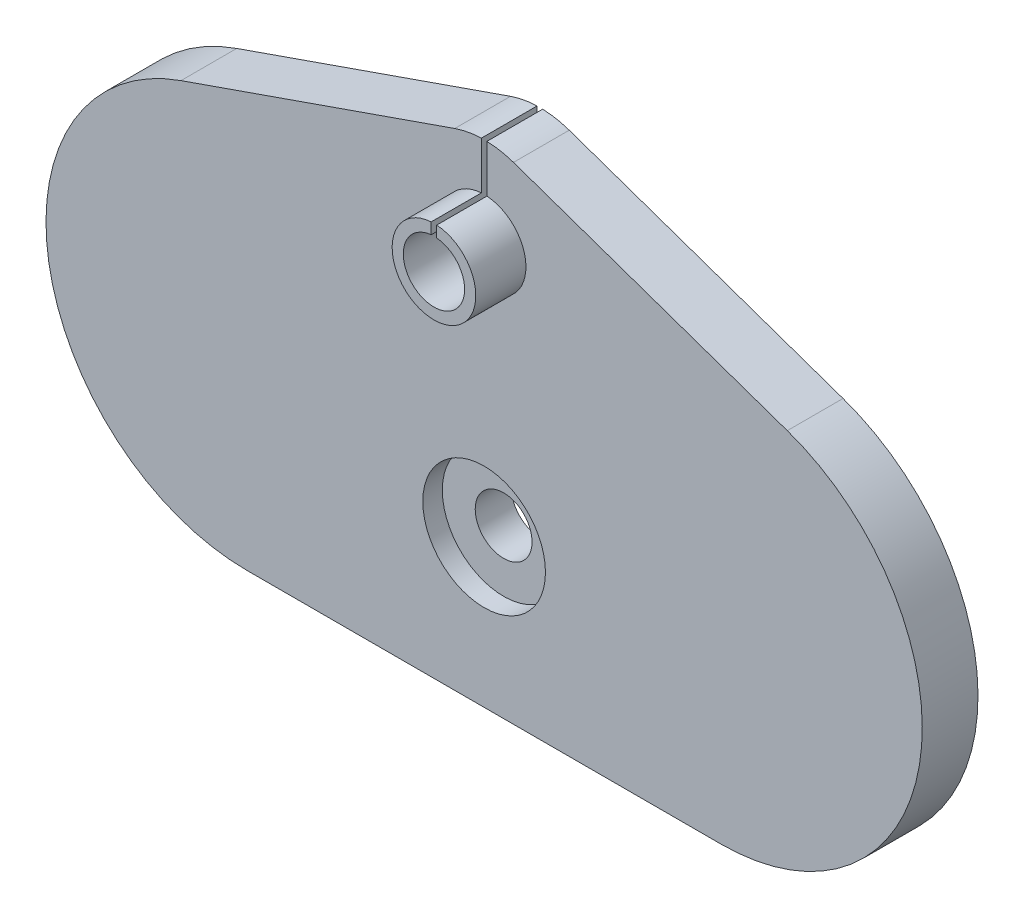
ISO-10303-21;
HEADER;
FILE_DESCRIPTION(('STEP AP214'),'2;1');
FILE_NAME('part.step','',(''),(''),'','','');
FILE_SCHEMA(('AUTOMOTIVE_DESIGN { 1 0 10303 214 1 1 1 1 }'));
ENDSEC;
DATA;
#1=APPLICATION_CONTEXT('core data for automotive mechanical design processes');
#2=APPLICATION_PROTOCOL_DEFINITION('international standard','automotive_design',2000,#1);
#3=PRODUCT_CONTEXT('',#1,'mechanical');
#4=PRODUCT('Part','Part','',(#3));
#5=PRODUCT_RELATED_PRODUCT_CATEGORY('part','',(#4));
#6=PRODUCT_DEFINITION_FORMATION('','',#4);
#7=PRODUCT_DEFINITION_CONTEXT('part definition',#1,'design');
#8=PRODUCT_DEFINITION('design','',#6,#7);
#9=PRODUCT_DEFINITION_SHAPE('','',#8);
#10=(LENGTH_UNIT() NAMED_UNIT(*) SI_UNIT(.MILLI.,.METRE.));
#11=(NAMED_UNIT(*) PLANE_ANGLE_UNIT() SI_UNIT($,.RADIAN.));
#12=(NAMED_UNIT(*) SI_UNIT($,.STERADIAN.) SOLID_ANGLE_UNIT());
#13=UNCERTAINTY_MEASURE_WITH_UNIT(LENGTH_MEASURE(1.E-05),#10,'distance_accuracy_value','');
#14=(GEOMETRIC_REPRESENTATION_CONTEXT(3) GLOBAL_UNCERTAINTY_ASSIGNED_CONTEXT((#13)) GLOBAL_UNIT_ASSIGNED_CONTEXT((#10,
#11,#12)) REPRESENTATION_CONTEXT('',''));
#15=CARTESIAN_POINT('',(0.,0.,0.));
#16=DIRECTION('',(0.,0.,1.));
#17=DIRECTION('',(1.,0.,0.));
#18=AXIS2_PLACEMENT_3D('',#15,#16,#17);
#19=CARTESIAN_POINT('',(0.,-16.,10.));
#20=DIRECTION('',(0.,0.,-1.));
#21=DIRECTION('',(-1.,0.,0.));
#22=AXIS2_PLACEMENT_3D('',#19,#20,#21);
#23=CYLINDRICAL_SURFACE('',#22,16.);
#24=DIRECTION('',(0.,0.,-1.));
#25=VECTOR('',#24,1.);
#26=CARTESIAN_POINT('',(0.5,-0.00781440828052579,10.));
#27=LINE('',#26,#25);
#28=CARTESIAN_POINT('',(0.5,-0.00781440828052579,10.));
#29=VERTEX_POINT('',#28);
#30=CARTESIAN_POINT('',(0.5,-0.00781440828052579,0.));
#31=VERTEX_POINT('',#30);
#32=EDGE_CURVE('E296',#29,#31,#27,.T.);
#33=ORIENTED_EDGE('',*,*,#32,.F.);
#34=CARTESIAN_POINT('',(0.,-16.,10.));
#35=DIRECTION('',(0.,0.,1.));
#36=DIRECTION('',(1.,0.,0.));
#37=AXIS2_PLACEMENT_3D('',#34,#35,#36);
#38=CIRCLE('',#37,16.);
#39=CARTESIAN_POINT('',(5.2663496670273,-0.891540078995424,10.));
#40=VERTEX_POINT('',#39);
#41=EDGE_CURVE('E259',#40,#29,#38,.T.);
#42=ORIENTED_EDGE('',*,*,#41,.F.);
#43=DIRECTION('',(0.,0.,-1.));
#44=VECTOR('',#43,1.);
#45=CARTESIAN_POINT('',(5.2663496670273,-0.891540078995424,10.));
#46=LINE('',#45,#44);
#47=CARTESIAN_POINT('',(5.2663496670273,-0.891540078995424,0.));
#48=VERTEX_POINT('',#47);
#49=EDGE_CURVE('E224',#40,#48,#46,.T.);
#50=ORIENTED_EDGE('',*,*,#49,.T.);
#51=CARTESIAN_POINT('',(0.,-16.,0.));
#52=DIRECTION('',(0.,0.,1.));
#53=DIRECTION('',(1.,0.,0.));
#54=AXIS2_PLACEMENT_3D('',#51,#52,#53);
#55=CIRCLE('',#54,16.);
#56=EDGE_CURVE('E184',#48,#31,#55,.T.);
#57=ORIENTED_EDGE('',*,*,#56,.T.);
#58=EDGE_LOOP('',(#33,#42,#50,#57));
#59=FACE_BOUND('',#58,.T.);
#60=ADVANCED_FACE('F45',(#59),#23,.T.);
#61=DIRECTION('',(0.,0.,-1.));
#62=VECTOR('',#61,1.);
#63=CARTESIAN_POINT('',(-0.5,-0.00781440828052579,10.));
#64=LINE('',#63,#62);
#65=CARTESIAN_POINT('',(-0.5,-0.00781440828052579,0.));
#66=VERTEX_POINT('',#65);
#67=CARTESIAN_POINT('',(-0.5,-0.00781440828052579,10.));
#68=VERTEX_POINT('',#67);
#69=EDGE_CURVE('E367',#66,#68,#64,.F.);
#70=ORIENTED_EDGE('',*,*,#69,.F.);
#71=CARTESIAN_POINT('',(-5.2663496670273,-0.891540078995424,0.));
#72=VERTEX_POINT('',#71);
#73=EDGE_CURVE('E165',#66,#72,#55,.T.);
#74=ORIENTED_EDGE('',*,*,#73,.T.);
#75=DIRECTION('',(0.,0.,-1.));
#76=VECTOR('',#75,1.);
#77=CARTESIAN_POINT('',(-5.2663496670273,-0.891540078995424,10.));
#78=LINE('',#77,#76);
#79=CARTESIAN_POINT('',(-5.2663496670273,-0.891540078995424,10.));
#80=VERTEX_POINT('',#79);
#81=EDGE_CURVE('E220',#80,#72,#78,.T.);
#82=ORIENTED_EDGE('',*,*,#81,.F.);
#83=EDGE_CURVE('E258',#68,#80,#38,.T.);
#84=ORIENTED_EDGE('',*,*,#83,.F.);
#85=EDGE_LOOP('',(#70,#74,#82,#84));
#86=FACE_BOUND('',#85,.T.);
#87=ADVANCED_FACE('F332',(#86),#23,.T.);
#88=CARTESIAN_POINT('',(0.,-16.,10.));
#89=DIRECTION('',(0.,0.,-1.));
#90=DIRECTION('',(-1.,0.,0.));
#91=AXIS2_PLACEMENT_3D('',#88,#89,#90);
#92=CYLINDRICAL_SURFACE('',#91,6.);
#93=CARTESIAN_POINT('',(0.,-16.,10.));
#94=DIRECTION('',(0.,0.,1.));
#95=DIRECTION('',(1.,0.,0.));
#96=AXIS2_PLACEMENT_3D('',#93,#94,#95);
#97=CIRCLE('',#96,6.);
#98=CARTESIAN_POINT('',(-0.5,-10.0208696284493,10.));
#99=VERTEX_POINT('',#98);
#100=CARTESIAN_POINT('',(0.5,-10.0208696284493,10.));
#101=VERTEX_POINT('',#100);
#102=EDGE_CURVE('E172',#99,#101,#97,.T.);
#103=ORIENTED_EDGE('',*,*,#102,.T.);
#104=DIRECTION('',(0.,0.,-1.));
#105=VECTOR('',#104,1.);
#106=CARTESIAN_POINT('',(0.5,-10.0208696284493,10.));
#107=LINE('',#106,#105);
#108=CARTESIAN_POINT('',(0.5,-10.0208696284493,0.));
#109=VERTEX_POINT('',#108);
#110=EDGE_CURVE('E169',#101,#109,#107,.T.);
#111=ORIENTED_EDGE('',*,*,#110,.T.);
#112=CARTESIAN_POINT('',(0.,-16.,0.));
#113=DIRECTION('',(0.,0.,1.));
#114=DIRECTION('',(1.,0.,0.));
#115=AXIS2_PLACEMENT_3D('',#112,#113,#114);
#116=CIRCLE('',#115,6.);
#117=CARTESIAN_POINT('',(-0.5,-10.0208696284493,0.));
#118=VERTEX_POINT('',#117);
#119=EDGE_CURVE('E163',#118,#109,#116,.T.);
#120=ORIENTED_EDGE('',*,*,#119,.F.);
#121=DIRECTION('',(0.,0.,-1.));
#122=VECTOR('',#121,1.);
#123=CARTESIAN_POINT('',(-0.5,-10.0208696284493,10.));
#124=LINE('',#123,#122);
#125=EDGE_CURVE('E144',#118,#99,#124,.F.);
#126=ORIENTED_EDGE('',*,*,#125,.T.);
#127=EDGE_LOOP('',(#103,#111,#120,#126));
#128=FACE_BOUND('',#127,.T.);
#129=ADVANCED_FACE('F47',(#128),#92,.F.);
#130=CARTESIAN_POINT('',(0.,0.,10.));
#131=DIRECTION('',(0.,0.,1.));
#132=DIRECTION('',(1.,0.,0.));
#133=AXIS2_PLACEMENT_3D('',#130,#131,#132);
#134=PLANE('',#133);
#135=CARTESIAN_POINT('',(0.,-61.6975077461451,10.));
#136=DIRECTION('',(0.,0.,1.));
#137=DIRECTION('',(1.,0.,0.));
#138=AXIS2_PLACEMENT_3D('',#135,#136,#137);
#139=CIRCLE('',#138,11.);
#140=CARTESIAN_POINT('',(11.,-61.6975077461451,10.));
#141=VERTEX_POINT('',#140);
#142=EDGE_CURVE('E181',#141,#141,#139,.T.);
#143=ORIENTED_EDGE('',*,*,#142,.F.);
#144=EDGE_LOOP('',(#143));
#145=FACE_BOUND('',#144,.T.);
#146=ORIENTED_EDGE('',*,*,#41,.T.);
#147=DIRECTION('',(0.,-1.,0.));
#148=VECTOR('',#147,1.);
#149=CARTESIAN_POINT('',(0.5,0.,10.));
#150=LINE('',#149,#148);
#151=CARTESIAN_POINT('',(0.5,-8.51668522645212,10.));
#152=VERTEX_POINT('',#151);
#153=EDGE_CURVE('E292',#29,#152,#150,.T.);
#154=ORIENTED_EDGE('',*,*,#153,.T.);
#155=CARTESIAN_POINT('',(0.,-16.,10.));
#156=DIRECTION('',(0.,0.,1.));
#157=DIRECTION('',(1.,0.,0.));
#158=AXIS2_PLACEMENT_3D('',#155,#156,#157);
#159=CIRCLE('',#158,7.5);
#160=CARTESIAN_POINT('',(-0.5,-8.51668522645212,10.));
#161=VERTEX_POINT('',#160);
#162=EDGE_CURVE('E242',#161,#152,#159,.T.);
#163=ORIENTED_EDGE('',*,*,#162,.F.);
#164=DIRECTION('',(0.,1.,0.));
#165=VECTOR('',#164,1.);
#166=CARTESIAN_POINT('',(-0.5,0.,10.));
#167=LINE('',#166,#165);
#168=EDGE_CURVE('E363',#161,#68,#167,.T.);
#169=ORIENTED_EDGE('',*,*,#168,.T.);
#170=ORIENTED_EDGE('',*,*,#83,.T.);
#171=DIRECTION('',(-0.944278745062786,-0.329146854189206,0.));
#172=VECTOR('',#171,1.);
#173=CARTESIAN_POINT('',(-0.293447612384942,0.841862346966983,10.));
#174=LINE('',#173,#172);
#175=CARTESIAN_POINT('',(-54.3805557019594,-18.0112586969587,10.));
#176=VERTEX_POINT('',#175);
#177=EDGE_CURVE('E263',#80,#176,#174,.T.);
#178=ORIENTED_EDGE('',*,*,#177,.T.);
#179=CARTESIAN_POINT('',(-42.5,-52.095,10.));
#180=DIRECTION('',(0.,0.,1.));
#181=DIRECTION('',(1.,0.,0.));
#182=AXIS2_PLACEMENT_3D('',#179,#180,#181);
#183=CIRCLE('',#182,36.095);
#184=CARTESIAN_POINT('',(-42.5,-88.19,10.));
#185=VERTEX_POINT('',#184);
#186=EDGE_CURVE('E267',#176,#185,#183,.T.);
#187=ORIENTED_EDGE('',*,*,#186,.T.);
#188=DIRECTION('',(1.,0.,0.));
#189=VECTOR('',#188,1.);
#190=CARTESIAN_POINT('',(0.,-88.19,10.));
#191=LINE('',#190,#189);
#192=CARTESIAN_POINT('',(42.5,-88.19,10.));
#193=VERTEX_POINT('',#192);
#194=EDGE_CURVE('E271',#185,#193,#191,.T.);
#195=ORIENTED_EDGE('',*,*,#194,.T.);
#196=CARTESIAN_POINT('',(42.5,-52.095,10.));
#197=DIRECTION('',(0.,0.,1.));
#198=DIRECTION('',(1.,0.,0.));
#199=AXIS2_PLACEMENT_3D('',#196,#197,#198);
#200=CIRCLE('',#199,36.095);
#201=CARTESIAN_POINT('',(54.3805557019594,-18.0112586969587,10.));
#202=VERTEX_POINT('',#201);
#203=EDGE_CURVE('E274',#193,#202,#200,.T.);
#204=ORIENTED_EDGE('',*,*,#203,.T.);
#205=DIRECTION('',(0.944278745062786,-0.329146854189206,0.));
#206=VECTOR('',#205,1.);
#207=CARTESIAN_POINT('',(0.293447612384942,0.841862346966983,10.));
#208=LINE('',#207,#206);
#209=EDGE_CURVE('E204',#40,#202,#208,.T.);
#210=ORIENTED_EDGE('',*,*,#209,.F.);
#211=EDGE_LOOP('',(#146,#154,#163,#169,#170,#178,#187,#195,#204,#210));
#212=FACE_BOUND('',#211,.T.);
#213=ADVANCED_FACE('F286',(#145,#212),#134,.T.);
#214=CARTESIAN_POINT('',(0.,0.,0.));
#215=DIRECTION('',(0.,0.,1.));
#216=DIRECTION('',(1.,0.,0.));
#217=AXIS2_PLACEMENT_3D('',#214,#215,#216);
#218=PLANE('',#217);
#219=CARTESIAN_POINT('',(-5.01437036244279E-13,-61.697507746145,0.));
#220=DIRECTION('',(0.,0.,-1.));
#221=DIRECTION('',(-1.,0.,0.));
#222=AXIS2_PLACEMENT_3D('',#219,#220,#221);
#223=CIRCLE('',#222,5.1);
#224=CARTESIAN_POINT('',(-5.1000000000005,-61.697507746145,0.));
#225=VERTEX_POINT('',#224);
#226=EDGE_CURVE('E298',#225,#225,#223,.T.);
#227=ORIENTED_EDGE('',*,*,#226,.F.);
#228=EDGE_LOOP('',(#227));
#229=FACE_BOUND('',#228,.T.);
#230=DIRECTION('',(0.,1.,0.));
#231=VECTOR('',#230,1.);
#232=CARTESIAN_POINT('',(0.5,-12.19,0.));
#233=LINE('',#232,#231);
#234=EDGE_CURVE('E352',#109,#31,#233,.T.);
#235=ORIENTED_EDGE('',*,*,#234,.T.);
#236=ORIENTED_EDGE('',*,*,#56,.F.);
#237=DIRECTION('',(0.944278745062786,-0.329146854189206,0.));
#238=VECTOR('',#237,1.);
#239=CARTESIAN_POINT('',(0.293447612384942,0.841862346966983,0.));
#240=LINE('',#239,#238);
#241=CARTESIAN_POINT('',(54.3805557019594,-18.0112586969587,0.));
#242=VERTEX_POINT('',#241);
#243=EDGE_CURVE('E171',#48,#242,#240,.T.);
#244=ORIENTED_EDGE('',*,*,#243,.T.);
#245=CARTESIAN_POINT('',(42.5,-52.095,0.));
#246=DIRECTION('',(0.,0.,1.));
#247=DIRECTION('',(1.,0.,0.));
#248=AXIS2_PLACEMENT_3D('',#245,#246,#247);
#249=CIRCLE('',#248,36.095);
#250=CARTESIAN_POINT('',(42.5,-88.19,0.));
#251=VERTEX_POINT('',#250);
#252=EDGE_CURVE('E200',#251,#242,#249,.T.);
#253=ORIENTED_EDGE('',*,*,#252,.F.);
#254=DIRECTION('',(1.,0.,0.));
#255=VECTOR('',#254,1.);
#256=CARTESIAN_POINT('',(0.,-88.19,0.));
#257=LINE('',#256,#255);
#258=CARTESIAN_POINT('',(-42.5,-88.19,0.));
#259=VERTEX_POINT('',#258);
#260=EDGE_CURVE('E196',#259,#251,#257,.T.);
#261=ORIENTED_EDGE('',*,*,#260,.F.);
#262=CARTESIAN_POINT('',(-42.5,-52.095,0.));
#263=DIRECTION('',(0.,0.,1.));
#264=DIRECTION('',(1.,0.,0.));
#265=AXIS2_PLACEMENT_3D('',#262,#263,#264);
#266=CIRCLE('',#265,36.095);
#267=CARTESIAN_POINT('',(-54.3805557019594,-18.0112586969587,0.));
#268=VERTEX_POINT('',#267);
#269=EDGE_CURVE('E192',#268,#259,#266,.T.);
#270=ORIENTED_EDGE('',*,*,#269,.F.);
#271=DIRECTION('',(-0.944278745062786,-0.329146854189206,0.));
#272=VECTOR('',#271,1.);
#273=CARTESIAN_POINT('',(-0.293447612384942,0.841862346966983,0.));
#274=LINE('',#273,#272);
#275=EDGE_CURVE('E188',#72,#268,#274,.T.);
#276=ORIENTED_EDGE('',*,*,#275,.F.);
#277=ORIENTED_EDGE('',*,*,#73,.F.);
#278=DIRECTION('',(0.,1.,0.));
#279=VECTOR('',#278,1.);
#280=CARTESIAN_POINT('',(-0.5,-12.19,0.));
#281=LINE('',#280,#279);
#282=EDGE_CURVE('E147',#118,#66,#281,.T.);
#283=ORIENTED_EDGE('',*,*,#282,.F.);
#284=ORIENTED_EDGE('',*,*,#119,.T.);
#285=EDGE_LOOP('',(#235,#236,#244,#253,#261,#270,#276,#277,#283,#284));
#286=FACE_BOUND('',#285,.T.);
#287=ADVANCED_FACE('F162',(#229,#286),#218,.F.);
#288=CARTESIAN_POINT('',(0.,-16.,10.));
#289=DIRECTION('',(0.,0.,1.));
#290=DIRECTION('',(1.,0.,0.));
#291=AXIS2_PLACEMENT_3D('',#288,#289,#290);
#292=PLANE('',#291);
#293=DIRECTION('',(0.,-1.,0.));
#294=VECTOR('',#293,1.);
#295=CARTESIAN_POINT('',(0.5,-16.,10.));
#296=LINE('',#295,#294);
#297=CARTESIAN_POINT('',(0.5,-10.5227744249483,10.));
#298=VERTEX_POINT('',#297);
#299=EDGE_CURVE('E61',#101,#298,#296,.T.);
#300=ORIENTED_EDGE('',*,*,#299,.F.);
#301=ORIENTED_EDGE('',*,*,#102,.F.);
#302=DIRECTION('',(0.,1.,0.));
#303=VECTOR('',#302,1.);
#304=CARTESIAN_POINT('',(-0.5,-16.,10.));
#305=LINE('',#304,#303);
#306=CARTESIAN_POINT('',(-0.5,-10.5227744249483,10.));
#307=VERTEX_POINT('',#306);
#308=EDGE_CURVE('E150',#307,#99,#305,.T.);
#309=ORIENTED_EDGE('',*,*,#308,.F.);
#310=CARTESIAN_POINT('',(0.,-16.,10.));
#311=DIRECTION('',(0.,0.,1.));
#312=DIRECTION('',(1.,0.,0.));
#313=AXIS2_PLACEMENT_3D('',#310,#311,#312);
#314=CIRCLE('',#313,5.5);
#315=EDGE_CURVE('E234',#307,#298,#314,.T.);
#316=ORIENTED_EDGE('',*,*,#315,.T.);
#317=EDGE_LOOP('',(#300,#301,#309,#316));
#318=FACE_BOUND('',#317,.T.);
#319=ADVANCED_FACE('F396',(#318),#292,.F.);
#320=CARTESIAN_POINT('',(0.,-16.,19.));
#321=DIRECTION('',(0.,0.,1.));
#322=DIRECTION('',(1.,0.,0.));
#323=AXIS2_PLACEMENT_3D('',#320,#321,#322);
#324=PLANE('',#323);
#325=CARTESIAN_POINT('',(0.,-16.,19.));
#326=DIRECTION('',(0.,0.,1.));
#327=DIRECTION('',(1.,0.,0.));
#328=AXIS2_PLACEMENT_3D('',#325,#326,#327);
#329=CIRCLE('',#328,7.5);
#330=CARTESIAN_POINT('',(-0.5,-8.51668522645212,19.));
#331=VERTEX_POINT('',#330);
#332=CARTESIAN_POINT('',(0.5,-8.51668522645212,19.));
#333=VERTEX_POINT('',#332);
#334=EDGE_CURVE('E178',#331,#333,#329,.T.);
#335=ORIENTED_EDGE('',*,*,#334,.T.);
#336=DIRECTION('',(0.,1.,0.));
#337=VECTOR('',#336,1.);
#338=CARTESIAN_POINT('',(0.5,-12.19,19.));
#339=LINE('',#338,#337);
#340=CARTESIAN_POINT('',(0.5,-10.5227744249483,19.));
#341=VERTEX_POINT('',#340);
#342=EDGE_CURVE('E240',#341,#333,#339,.T.);
#343=ORIENTED_EDGE('',*,*,#342,.F.);
#344=CARTESIAN_POINT('',(0.,-16.,19.));
#345=DIRECTION('',(0.,0.,1.));
#346=DIRECTION('',(1.,0.,0.));
#347=AXIS2_PLACEMENT_3D('',#344,#345,#346);
#348=CIRCLE('',#347,5.5);
#349=CARTESIAN_POINT('',(-0.5,-10.5227744249483,19.));
#350=VERTEX_POINT('',#349);
#351=EDGE_CURVE('E232',#350,#341,#348,.T.);
#352=ORIENTED_EDGE('',*,*,#351,.F.);
#353=DIRECTION('',(0.,1.,0.));
#354=VECTOR('',#353,1.);
#355=CARTESIAN_POINT('',(-0.5,-12.19,19.));
#356=LINE('',#355,#354);
#357=EDGE_CURVE('E68',#350,#331,#356,.T.);
#358=ORIENTED_EDGE('',*,*,#357,.T.);
#359=EDGE_LOOP('',(#335,#343,#352,#358));
#360=FACE_BOUND('',#359,.T.);
#361=ADVANCED_FACE('F238',(#360),#324,.T.);
#362=CARTESIAN_POINT('',(0.,-16.,19.));
#363=DIRECTION('',(0.,0.,-1.));
#364=DIRECTION('',(-1.,0.,0.));
#365=AXIS2_PLACEMENT_3D('',#362,#363,#364);
#366=CYLINDRICAL_SURFACE('',#365,7.5);
#367=DIRECTION('',(0.,0.,-1.));
#368=VECTOR('',#367,1.);
#369=CARTESIAN_POINT('',(0.5,-8.51668522645212,19.));
#370=LINE('',#369,#368);
#371=EDGE_CURVE('E304',#333,#152,#370,.T.);
#372=ORIENTED_EDGE('',*,*,#371,.F.);
#373=ORIENTED_EDGE('',*,*,#334,.F.);
#374=DIRECTION('',(0.,0.,-1.));
#375=VECTOR('',#374,1.);
#376=CARTESIAN_POINT('',(-0.5,-8.51668522645212,19.));
#377=LINE('',#376,#375);
#378=EDGE_CURVE('E156',#161,#331,#377,.F.);
#379=ORIENTED_EDGE('',*,*,#378,.F.);
#380=ORIENTED_EDGE('',*,*,#162,.T.);
#381=EDGE_LOOP('',(#372,#373,#379,#380));
#382=FACE_BOUND('',#381,.T.);
#383=ADVANCED_FACE('F377',(#382),#366,.T.);
#384=CARTESIAN_POINT('',(0.,-16.,19.));
#385=DIRECTION('',(0.,0.,-1.));
#386=DIRECTION('',(-1.,0.,0.));
#387=AXIS2_PLACEMENT_3D('',#384,#385,#386);
#388=CYLINDRICAL_SURFACE('',#387,5.5);
#389=ORIENTED_EDGE('',*,*,#351,.T.);
#390=DIRECTION('',(0.,0.,-1.));
#391=VECTOR('',#390,1.);
#392=CARTESIAN_POINT('',(0.5,-10.5227744249483,19.));
#393=LINE('',#392,#391);
#394=EDGE_CURVE('E11',#341,#298,#393,.T.);
#395=ORIENTED_EDGE('',*,*,#394,.T.);
#396=ORIENTED_EDGE('',*,*,#315,.F.);
#397=DIRECTION('',(0.,0.,-1.));
#398=VECTOR('',#397,1.);
#399=CARTESIAN_POINT('',(-0.5,-10.5227744249483,19.));
#400=LINE('',#399,#398);
#401=EDGE_CURVE('E54',#307,#350,#400,.F.);
#402=ORIENTED_EDGE('',*,*,#401,.T.);
#403=EDGE_LOOP('',(#389,#395,#396,#402));
#404=FACE_BOUND('',#403,.T.);
#405=ADVANCED_FACE('F231',(#404),#388,.F.);
#406=CARTESIAN_POINT('',(0.,-61.6975077461451,10.));
#407=DIRECTION('',(0.,0.,-1.));
#408=DIRECTION('',(-1.,0.,0.));
#409=AXIS2_PLACEMENT_3D('',#406,#407,#408);
#410=CYLINDRICAL_SURFACE('',#409,11.);
#411=ORIENTED_EDGE('',*,*,#142,.T.);
#412=EDGE_LOOP('',(#411));
#413=FACE_BOUND('',#412,.T.);
#414=CARTESIAN_POINT('',(-5.01437036244279E-13,-61.697507746145,6.5));
#415=DIRECTION('',(0.,0.,-1.));
#416=DIRECTION('',(-1.,0.,0.));
#417=AXIS2_PLACEMENT_3D('',#414,#415,#416);
#418=CIRCLE('',#417,11.);
#419=CARTESIAN_POINT('',(-11.0000000000005,-61.697507746145,6.5));
#420=VERTEX_POINT('',#419);
#421=EDGE_CURVE('E248',#420,#420,#418,.T.);
#422=ORIENTED_EDGE('',*,*,#421,.T.);
#423=EDGE_LOOP('',(#422));
#424=FACE_BOUND('',#423,.T.);
#425=ADVANCED_FACE('F283',(#413,#424),#410,.F.);
#426=CARTESIAN_POINT('',(0.293447612384942,0.841862346966983,10.));
#427=DIRECTION('',(0.329146854189206,0.944278745062786,0.));
#428=DIRECTION('',(-0.944278745062786,0.329146854189206,0.));
#429=AXIS2_PLACEMENT_3D('',#426,#427,#428);
#430=PLANE('',#429);
#431=ORIENTED_EDGE('',*,*,#243,.F.);
#432=ORIENTED_EDGE('',*,*,#49,.F.);
#433=ORIENTED_EDGE('',*,*,#209,.T.);
#434=DIRECTION('',(0.,0.,-1.));
#435=VECTOR('',#434,1.);
#436=CARTESIAN_POINT('',(54.3805557019594,-18.0112586969587,10.));
#437=LINE('',#436,#435);
#438=EDGE_CURVE('E205',#202,#242,#437,.T.);
#439=ORIENTED_EDGE('',*,*,#438,.T.);
#440=EDGE_LOOP('',(#431,#432,#433,#439));
#441=FACE_BOUND('',#440,.T.);
#442=ADVANCED_FACE('F341',(#441),#430,.T.);
#443=CARTESIAN_POINT('',(-0.293447612384942,0.841862346966983,10.));
#444=DIRECTION('',(0.329146854189206,-0.944278745062786,0.));
#445=DIRECTION('',(0.944278745062786,0.329146854189206,0.));
#446=AXIS2_PLACEMENT_3D('',#443,#444,#445);
#447=PLANE('',#446);
#448=ORIENTED_EDGE('',*,*,#275,.T.);
#449=DIRECTION('',(0.,0.,-1.));
#450=VECTOR('',#449,1.);
#451=CARTESIAN_POINT('',(-54.3805557019594,-18.0112586969587,10.));
#452=LINE('',#451,#450);
#453=EDGE_CURVE('E216',#176,#268,#452,.T.);
#454=ORIENTED_EDGE('',*,*,#453,.F.);
#455=ORIENTED_EDGE('',*,*,#177,.F.);
#456=ORIENTED_EDGE('',*,*,#81,.T.);
#457=EDGE_LOOP('',(#448,#454,#455,#456));
#458=FACE_BOUND('',#457,.T.);
#459=ADVANCED_FACE('F339',(#458),#447,.F.);
#460=CARTESIAN_POINT('',(-42.5,-52.095,10.));
#461=DIRECTION('',(0.,0.,-1.));
#462=DIRECTION('',(-1.,0.,0.));
#463=AXIS2_PLACEMENT_3D('',#460,#461,#462);
#464=CYLINDRICAL_SURFACE('',#463,36.095);
#465=ORIENTED_EDGE('',*,*,#269,.T.);
#466=DIRECTION('',(0.,0.,-1.));
#467=VECTOR('',#466,1.);
#468=CARTESIAN_POINT('',(-42.5,-88.19,10.));
#469=LINE('',#468,#467);
#470=EDGE_CURVE('E212',#185,#259,#469,.T.);
#471=ORIENTED_EDGE('',*,*,#470,.F.);
#472=ORIENTED_EDGE('',*,*,#186,.F.);
#473=ORIENTED_EDGE('',*,*,#453,.T.);
#474=EDGE_LOOP('',(#465,#471,#472,#473));
#475=FACE_BOUND('',#474,.T.);
#476=ADVANCED_FACE('F348',(#475),#464,.T.);
#477=CARTESIAN_POINT('',(0.,-88.19,10.));
#478=DIRECTION('',(0.,1.,0.));
#479=DIRECTION('',(0.,0.,1.));
#480=AXIS2_PLACEMENT_3D('',#477,#478,#479);
#481=PLANE('',#480);
#482=ORIENTED_EDGE('',*,*,#260,.T.);
#483=DIRECTION('',(0.,0.,-1.));
#484=VECTOR('',#483,1.);
#485=CARTESIAN_POINT('',(42.5,-88.19,10.));
#486=LINE('',#485,#484);
#487=EDGE_CURVE('E208',#193,#251,#486,.T.);
#488=ORIENTED_EDGE('',*,*,#487,.F.);
#489=ORIENTED_EDGE('',*,*,#194,.F.);
#490=ORIENTED_EDGE('',*,*,#470,.T.);
#491=EDGE_LOOP('',(#482,#488,#489,#490));
#492=FACE_BOUND('',#491,.T.);
#493=ADVANCED_FACE('F327',(#492),#481,.F.);
#494=CARTESIAN_POINT('',(42.5,-52.095,10.));
#495=DIRECTION('',(0.,0.,-1.));
#496=DIRECTION('',(-1.,0.,0.));
#497=AXIS2_PLACEMENT_3D('',#494,#495,#496);
#498=CYLINDRICAL_SURFACE('',#497,36.095);
#499=ORIENTED_EDGE('',*,*,#252,.T.);
#500=ORIENTED_EDGE('',*,*,#438,.F.);
#501=ORIENTED_EDGE('',*,*,#203,.F.);
#502=ORIENTED_EDGE('',*,*,#487,.T.);
#503=EDGE_LOOP('',(#499,#500,#501,#502));
#504=FACE_BOUND('',#503,.T.);
#505=ADVANCED_FACE('F319',(#504),#498,.T.);
#506=CARTESIAN_POINT('',(-5.01437036244279E-13,-61.697507746145,6.5));
#507=DIRECTION('',(0.,0.,-1.));
#508=DIRECTION('',(-1.,0.,0.));
#509=AXIS2_PLACEMENT_3D('',#506,#507,#508);
#510=PLANE('',#509);
#511=CARTESIAN_POINT('',(-5.01437036244279E-13,-61.697507746145,6.5));
#512=DIRECTION('',(0.,0.,-1.));
#513=DIRECTION('',(-1.,0.,0.));
#514=AXIS2_PLACEMENT_3D('',#511,#512,#513);
#515=CIRCLE('',#514,5.1);
#516=CARTESIAN_POINT('',(-5.1000000000005,-61.697507746145,6.5));
#517=VERTEX_POINT('',#516);
#518=EDGE_CURVE('E303',#517,#517,#515,.T.);
#519=ORIENTED_EDGE('',*,*,#518,.T.);
#520=EDGE_LOOP('',(#519));
#521=FACE_BOUND('',#520,.T.);
#522=ORIENTED_EDGE('',*,*,#421,.F.);
#523=EDGE_LOOP('',(#522));
#524=FACE_BOUND('',#523,.T.);
#525=ADVANCED_FACE('F316',(#521,#524),#510,.F.);
#526=CARTESIAN_POINT('',(-5.01437036244279E-13,-61.697507746145,6.5));
#527=DIRECTION('',(0.,0.,-1.));
#528=DIRECTION('',(-1.,0.,0.));
#529=AXIS2_PLACEMENT_3D('',#526,#527,#528);
#530=CYLINDRICAL_SURFACE('',#529,5.1);
#531=CARTESIAN_POINT('',(-5.1000000000005,-61.697507746145,6.5));
#532=CARTESIAN_POINT('',(-5.1000000000005,-61.697507746145,6.43229166666667));
#533=CARTESIAN_POINT('',(-5.1000000000005,-61.697507746145,6.36458333333333));
#534=CARTESIAN_POINT('',(-5.1000000000005,-61.697507746145,6.22916666666667));
#535=CARTESIAN_POINT('',(-5.1000000000005,-61.697507746145,6.16145833333333));
#536=CARTESIAN_POINT('',(-5.1000000000005,-61.697507746145,6.02604166666667));
#537=CARTESIAN_POINT('',(-5.1000000000005,-61.697507746145,5.95833333333333));
#538=CARTESIAN_POINT('',(-5.1000000000005,-61.697507746145,5.82291666666667));
#539=CARTESIAN_POINT('',(-5.1000000000005,-61.697507746145,5.75520833333333));
#540=CARTESIAN_POINT('',(-5.1000000000005,-61.697507746145,5.61979166666667));
#541=CARTESIAN_POINT('',(-5.1000000000005,-61.697507746145,5.55208333333333));
#542=CARTESIAN_POINT('',(-5.1000000000005,-61.697507746145,5.41666666666667));
#543=CARTESIAN_POINT('',(-5.1000000000005,-61.697507746145,5.34895833333333));
#544=CARTESIAN_POINT('',(-5.1000000000005,-61.697507746145,5.21354166666667));
#545=CARTESIAN_POINT('',(-5.1000000000005,-61.697507746145,5.14583333333333));
#546=CARTESIAN_POINT('',(-5.1000000000005,-61.697507746145,5.01041666666667));
#547=CARTESIAN_POINT('',(-5.1000000000005,-61.697507746145,4.94270833333333));
#548=CARTESIAN_POINT('',(-5.1000000000005,-61.697507746145,4.80729166666667));
#549=CARTESIAN_POINT('',(-5.1000000000005,-61.697507746145,4.73958333333333));
#550=CARTESIAN_POINT('',(-5.1000000000005,-61.697507746145,4.60416666666667));
#551=CARTESIAN_POINT('',(-5.1000000000005,-61.697507746145,4.53645833333333));
#552=CARTESIAN_POINT('',(-5.1000000000005,-61.697507746145,4.40104166666667));
#553=CARTESIAN_POINT('',(-5.1000000000005,-61.697507746145,4.33333333333333));
#554=CARTESIAN_POINT('',(-5.1000000000005,-61.697507746145,4.19791666666667));
#555=CARTESIAN_POINT('',(-5.1000000000005,-61.697507746145,4.13020833333333));
#556=CARTESIAN_POINT('',(-5.1000000000005,-61.697507746145,3.99479166666667));
#557=CARTESIAN_POINT('',(-5.1000000000005,-61.697507746145,3.92708333333333));
#558=CARTESIAN_POINT('',(-5.1000000000005,-61.697507746145,3.79166666666667));
#559=CARTESIAN_POINT('',(-5.1000000000005,-61.697507746145,3.72395833333333));
#560=CARTESIAN_POINT('',(-5.1000000000005,-61.697507746145,3.58854166666667));
#561=CARTESIAN_POINT('',(-5.1000000000005,-61.697507746145,3.52083333333333));
#562=CARTESIAN_POINT('',(-5.1000000000005,-61.697507746145,3.38541666666667));
#563=CARTESIAN_POINT('',(-5.1000000000005,-61.697507746145,3.31770833333333));
#564=CARTESIAN_POINT('',(-5.1000000000005,-61.697507746145,3.18229166666667));
#565=CARTESIAN_POINT('',(-5.1000000000005,-61.697507746145,3.11458333333333));
#566=CARTESIAN_POINT('',(-5.1000000000005,-61.697507746145,2.97916666666667));
#567=CARTESIAN_POINT('',(-5.1000000000005,-61.697507746145,2.91145833333333));
#568=CARTESIAN_POINT('',(-5.1000000000005,-61.697507746145,2.77604166666667));
#569=CARTESIAN_POINT('',(-5.1000000000005,-61.697507746145,2.70833333333333));
#570=CARTESIAN_POINT('',(-5.1000000000005,-61.697507746145,2.57291666666667));
#571=CARTESIAN_POINT('',(-5.1000000000005,-61.697507746145,2.50520833333333));
#572=CARTESIAN_POINT('',(-5.1000000000005,-61.697507746145,2.36979166666667));
#573=CARTESIAN_POINT('',(-5.1000000000005,-61.697507746145,2.30208333333333));
#574=CARTESIAN_POINT('',(-5.1000000000005,-61.697507746145,2.16666666666667));
#575=CARTESIAN_POINT('',(-5.1000000000005,-61.697507746145,2.09895833333333));
#576=CARTESIAN_POINT('',(-5.1000000000005,-61.697507746145,1.96354166666667));
#577=CARTESIAN_POINT('',(-5.1000000000005,-61.697507746145,1.89583333333333));
#578=CARTESIAN_POINT('',(-5.1000000000005,-61.697507746145,1.76041666666667));
#579=CARTESIAN_POINT('',(-5.1000000000005,-61.697507746145,1.69270833333333));
#580=CARTESIAN_POINT('',(-5.1000000000005,-61.697507746145,1.55729166666667));
#581=CARTESIAN_POINT('',(-5.1000000000005,-61.697507746145,1.48958333333333));
#582=CARTESIAN_POINT('',(-5.1000000000005,-61.697507746145,1.35416666666667));
#583=CARTESIAN_POINT('',(-5.1000000000005,-61.697507746145,1.28645833333333));
#584=CARTESIAN_POINT('',(-5.1000000000005,-61.697507746145,1.15104166666667));
#585=CARTESIAN_POINT('',(-5.1000000000005,-61.697507746145,1.08333333333333));
#586=CARTESIAN_POINT('',(-5.1000000000005,-61.697507746145,0.947916666666667));
#587=CARTESIAN_POINT('',(-5.1000000000005,-61.697507746145,0.880208333333333));
#588=CARTESIAN_POINT('',(-5.1000000000005,-61.697507746145,0.744791666666667));
#589=CARTESIAN_POINT('',(-5.1000000000005,-61.697507746145,0.677083333333333));
#590=CARTESIAN_POINT('',(-5.1000000000005,-61.697507746145,0.541666666666667));
#591=CARTESIAN_POINT('',(-5.1000000000005,-61.697507746145,0.473958333333333));
#592=CARTESIAN_POINT('',(-5.1000000000005,-61.697507746145,0.338541666666667));
#593=CARTESIAN_POINT('',(-5.1000000000005,-61.697507746145,0.270833333333334));
#594=CARTESIAN_POINT('',(-5.1000000000005,-61.697507746145,0.135416666666667));
#595=CARTESIAN_POINT('',(-5.1000000000005,-61.697507746145,0.0677083333333334));
#596=CARTESIAN_POINT('',(-5.1000000000005,-61.697507746145,0.));
#597=B_SPLINE_CURVE_WITH_KNOTS('',3,(#531,#532,#533,#534,#535,#536,#537,#538,#539,#540,#541,
#542,#543,#544,#545,#546,#547,#548,#549,#550,#551,#552,#553,#554,#555,#556,#557,#558,#559,#560,
#561,#562,#563,#564,#565,#566,#567,#568,#569,#570,#571,#572,#573,#574,#575,#576,#577,#578,#579,
#580,#581,#582,#583,#584,#585,#586,#587,#588,#589,#590,#591,#592,#593,#594,#595,#596),
.UNSPECIFIED.,.F.,.F.,(4,2,2,2,2,2,2,2,2,2,2,2,2,2,2,2,2,2,2,2,2,2,2,2,2,2,2,2,2,2,2,2,4),(0.,
0.203124999999999,0.40625,0.609375,0.8125,1.015625,1.21875,1.421875,1.625,1.828125,2.03125,
2.234375,2.4375,2.640625,2.84375,3.046875,3.25,3.453125,3.65625,3.859375,4.0625,4.265625,
4.46875,4.671875,4.875,5.078125,5.28125,5.484375,5.6875,5.890625,6.09375,6.296875,6.5),.UNSPECIFIED.);
#598=EDGE_CURVE('BSEAM318',#517,#225,#597,.T.);
#599=ORIENTED_EDGE('',*,*,#518,.F.);
#600=ORIENTED_EDGE('',*,*,#226,.T.);
#601=ORIENTED_EDGE('',*,*,#598,.T.);
#602=ORIENTED_EDGE('',*,*,#598,.F.);
#603=EDGE_LOOP('',(#599,#601,#600,#602));
#604=FACE_BOUND('',#603,.T.);
#605=ADVANCED_FACE('F318',(#604),#530,.F.);
#606=CARTESIAN_POINT('',(-0.5,-12.19,0.));
#607=DIRECTION('',(1.,0.,0.));
#608=DIRECTION('',(0.,0.,-1.));
#609=AXIS2_PLACEMENT_3D('',#606,#607,#608);
#610=PLANE('',#609);
#611=ORIENTED_EDGE('',*,*,#69,.T.);
#612=ORIENTED_EDGE('',*,*,#168,.F.);
#613=ORIENTED_EDGE('',*,*,#378,.T.);
#614=ORIENTED_EDGE('',*,*,#357,.F.);
#615=ORIENTED_EDGE('',*,*,#401,.F.);
#616=ORIENTED_EDGE('',*,*,#308,.T.);
#617=ORIENTED_EDGE('',*,*,#125,.F.);
#618=ORIENTED_EDGE('',*,*,#282,.T.);
#619=EDGE_LOOP('',(#611,#612,#613,#614,#615,#616,#617,#618));
#620=FACE_BOUND('',#619,.T.);
#621=ADVANCED_FACE('F146',(#620),#610,.T.);
#622=CARTESIAN_POINT('',(0.5,-12.19,19.));
#623=DIRECTION('',(-1.,0.,0.));
#624=DIRECTION('',(0.,0.,1.));
#625=AXIS2_PLACEMENT_3D('',#622,#623,#624);
#626=PLANE('',#625);
#627=ORIENTED_EDGE('',*,*,#32,.T.);
#628=ORIENTED_EDGE('',*,*,#234,.F.);
#629=ORIENTED_EDGE('',*,*,#110,.F.);
#630=ORIENTED_EDGE('',*,*,#299,.T.);
#631=ORIENTED_EDGE('',*,*,#394,.F.);
#632=ORIENTED_EDGE('',*,*,#342,.T.);
#633=ORIENTED_EDGE('',*,*,#371,.T.);
#634=ORIENTED_EDGE('',*,*,#153,.F.);
#635=EDGE_LOOP('',(#627,#628,#629,#630,#631,#632,#633,#634));
#636=FACE_BOUND('',#635,.T.);
#637=ADVANCED_FACE('F375',(#636),#626,.T.);
#638=CLOSED_SHELL('',(#60,#87,#129,#213,#287,#319,#361,#383,#405,#425,#442,#459,#476,#493,#505,
#525,#605,#621,#637));
#639=MANIFOLD_SOLID_BREP('B2',#638);
#640=ADVANCED_BREP_SHAPE_REPRESENTATION('',(#18,#639),#14);
#641=SHAPE_DEFINITION_REPRESENTATION(#9,#640);
ENDSEC;
END-ISO-10303-21;
